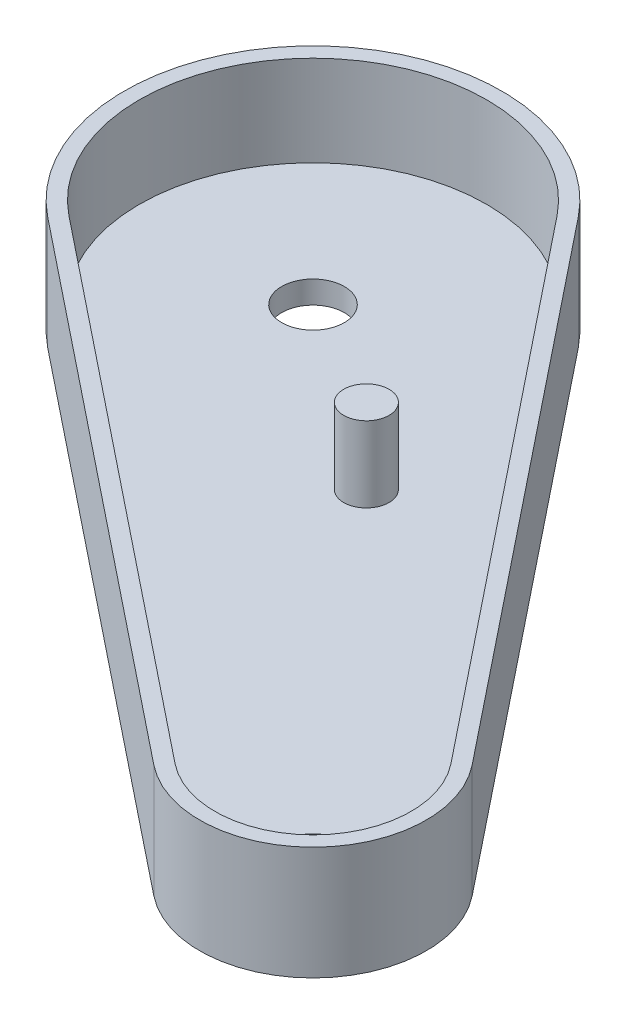
ISO-10303-21;
HEADER;
FILE_DESCRIPTION(('STEP AP214'),'2;1');
FILE_NAME('part.step','',(''),(''),'','','');
FILE_SCHEMA(('AUTOMOTIVE_DESIGN { 1 0 10303 214 1 1 1 1 }'));
ENDSEC;
DATA;
#1=APPLICATION_CONTEXT('core data for automotive mechanical design processes');
#2=APPLICATION_PROTOCOL_DEFINITION('international standard','automotive_design',2000,#1);
#3=PRODUCT_CONTEXT('',#1,'mechanical');
#4=PRODUCT('Part','Part','',(#3));
#5=PRODUCT_RELATED_PRODUCT_CATEGORY('part','',(#4));
#6=PRODUCT_DEFINITION_FORMATION('','',#4);
#7=PRODUCT_DEFINITION_CONTEXT('part definition',#1,'design');
#8=PRODUCT_DEFINITION('design','',#6,#7);
#9=PRODUCT_DEFINITION_SHAPE('','',#8);
#10=(LENGTH_UNIT() NAMED_UNIT(*) SI_UNIT(.MILLI.,.METRE.));
#11=(NAMED_UNIT(*) PLANE_ANGLE_UNIT() SI_UNIT($,.RADIAN.));
#12=(NAMED_UNIT(*) SI_UNIT($,.STERADIAN.) SOLID_ANGLE_UNIT());
#13=UNCERTAINTY_MEASURE_WITH_UNIT(LENGTH_MEASURE(1.E-05),#10,'distance_accuracy_value','');
#14=(GEOMETRIC_REPRESENTATION_CONTEXT(3) GLOBAL_UNCERTAINTY_ASSIGNED_CONTEXT((#13)) GLOBAL_UNIT_ASSIGNED_CONTEXT((#10,
#11,#12)) REPRESENTATION_CONTEXT('',''));
#15=CARTESIAN_POINT('',(0.,0.,0.));
#16=DIRECTION('',(0.,0.,1.));
#17=DIRECTION('',(1.,0.,0.));
#18=AXIS2_PLACEMENT_3D('',#15,#16,#17);
#19=CARTESIAN_POINT('',(-15.6040237198615,3.,19.5323947264538));
#20=DIRECTION('',(0.624160948794458,0.,-0.781295789058153));
#21=DIRECTION('',(-0.781295789058153,0.,-0.624160948794458));
#22=AXIS2_PLACEMENT_3D('',#19,#20,#21);
#23=PLANE('',#22);
#24=DIRECTION('',(0.781295789058153,0.,0.624160948794458));
#25=VECTOR('',#24,1.);
#26=CARTESIAN_POINT('',(-15.6040237198615,0.,19.5323947264538));
#27=LINE('',#26,#25);
#28=CARTESIAN_POINT('',(-15.6040237198615,0.,19.5323947264538));
#29=VERTEX_POINT('',#28);
#30=CARTESIAN_POINT('',(54.2771960748732,0.,75.3590471426608));
#31=VERTEX_POINT('',#30);
#32=EDGE_CURVE('E133',#29,#31,#27,.T.);
#33=ORIENTED_EDGE('',*,*,#32,.T.);
#34=DIRECTION('',(0.,-1.,0.));
#35=VECTOR('',#34,1.);
#36=CARTESIAN_POINT('',(54.2771960748732,3.,75.3590471426608));
#37=LINE('',#36,#35);
#38=CARTESIAN_POINT('',(54.2771960748732,15.,75.3590471426608));
#39=VERTEX_POINT('',#38);
#40=EDGE_CURVE('E11',#39,#31,#37,.T.);
#41=ORIENTED_EDGE('',*,*,#40,.F.);
#42=DIRECTION('',(0.781295789058153,0.,0.624160948794458));
#43=VECTOR('',#42,1.);
#44=CARTESIAN_POINT('',(-15.6040237198615,15.,19.5323947264538));
#45=LINE('',#44,#43);
#46=CARTESIAN_POINT('',(-15.6040237198615,15.,19.5323947264538));
#47=VERTEX_POINT('',#46);
#48=EDGE_CURVE('E146',#47,#39,#45,.T.);
#49=ORIENTED_EDGE('',*,*,#48,.F.);
#50=DIRECTION('',(0.,-1.,0.));
#51=VECTOR('',#50,1.);
#52=CARTESIAN_POINT('',(-15.6040237198615,3.,19.5323947264538));
#53=LINE('',#52,#51);
#54=EDGE_CURVE('E189',#47,#29,#53,.T.);
#55=ORIENTED_EDGE('',*,*,#54,.T.);
#56=EDGE_LOOP('',(#33,#41,#49,#55));
#57=FACE_BOUND('',#56,.T.);
#58=ADVANCED_FACE('F47',(#57),#23,.F.);
#59=CARTESIAN_POINT('',(63.6396103067901,3.,63.6396103067885));
#60=DIRECTION('',(0.,-1.,0.));
#61=DIRECTION('',(0.,0.,-1.));
#62=AXIS2_PLACEMENT_3D('',#59,#60,#61);
#63=CYLINDRICAL_SURFACE('',#62,15.);
#64=CARTESIAN_POINT('',(63.6396103067901,0.,63.6396103067885));
#65=DIRECTION('',(0.,1.,0.));
#66=DIRECTION('',(0.,0.,1.));
#67=AXIS2_PLACEMENT_3D('',#64,#65,#66);
#68=CIRCLE('',#67,15.);
#69=CARTESIAN_POINT('',(75.3590471426621,0.,54.2771960748713));
#70=VERTEX_POINT('',#69);
#71=EDGE_CURVE('E193',#31,#70,#68,.T.);
#72=ORIENTED_EDGE('',*,*,#71,.T.);
#73=DIRECTION('',(0.,-1.,0.));
#74=VECTOR('',#73,1.);
#75=CARTESIAN_POINT('',(75.3590471426621,3.,54.2771960748713));
#76=LINE('',#75,#74);
#77=CARTESIAN_POINT('',(75.3590471426621,15.,54.2771960748713));
#78=VERTEX_POINT('',#77);
#79=EDGE_CURVE('E55',#78,#70,#76,.T.);
#80=ORIENTED_EDGE('',*,*,#79,.F.);
#81=CARTESIAN_POINT('',(63.6396103067901,15.,63.6396103067885));
#82=DIRECTION('',(0.,1.,0.));
#83=DIRECTION('',(0.,0.,1.));
#84=AXIS2_PLACEMENT_3D('',#81,#82,#83);
#85=CIRCLE('',#84,15.);
#86=EDGE_CURVE('E150',#39,#78,#85,.T.);
#87=ORIENTED_EDGE('',*,*,#86,.F.);
#88=ORIENTED_EDGE('',*,*,#40,.T.);
#89=EDGE_LOOP('',(#72,#80,#87,#88));
#90=FACE_BOUND('',#89,.T.);
#91=ADVANCED_FACE('F223',(#90),#63,.T.);
#92=CARTESIAN_POINT('',(19.5323947264534,3.,-15.6040237198619));
#93=DIRECTION('',(0.781295789058138,0.,-0.624160948794477));
#94=DIRECTION('',(-0.624160948794477,0.,-0.781295789058138));
#95=AXIS2_PLACEMENT_3D('',#92,#93,#94);
#96=PLANE('',#95);
#97=DIRECTION('',(0.624160948794477,0.,0.781295789058138));
#98=VECTOR('',#97,1.);
#99=CARTESIAN_POINT('',(19.5323947264534,0.,-15.6040237198619));
#100=LINE('',#99,#98);
#101=CARTESIAN_POINT('',(19.5323947264534,0.,-15.6040237198619));
#102=VERTEX_POINT('',#101);
#103=EDGE_CURVE('E197',#102,#70,#100,.T.);
#104=ORIENTED_EDGE('',*,*,#103,.F.);
#105=DIRECTION('',(0.,-1.,0.));
#106=VECTOR('',#105,1.);
#107=CARTESIAN_POINT('',(19.5323947264534,3.,-15.6040237198619));
#108=LINE('',#107,#106);
#109=CARTESIAN_POINT('',(19.5323947264534,15.,-15.6040237198619));
#110=VERTEX_POINT('',#109);
#111=EDGE_CURVE('E214',#110,#102,#108,.T.);
#112=ORIENTED_EDGE('',*,*,#111,.F.);
#113=DIRECTION('',(-0.624160948794477,0.,-0.781295789058138));
#114=VECTOR('',#113,1.);
#115=CARTESIAN_POINT('',(19.5323947264534,15.,-15.6040237198619));
#116=LINE('',#115,#114);
#117=EDGE_CURVE('E154',#78,#110,#116,.T.);
#118=ORIENTED_EDGE('',*,*,#117,.F.);
#119=ORIENTED_EDGE('',*,*,#79,.T.);
#120=EDGE_LOOP('',(#104,#112,#118,#119));
#121=FACE_BOUND('',#120,.T.);
#122=ADVANCED_FACE('F220',(#121),#96,.T.);
#123=CARTESIAN_POINT('',(63.6396103067901,3.,63.6396103067885));
#124=DIRECTION('',(0.,-1.,0.));
#125=DIRECTION('',(0.,0.,-1.));
#126=AXIS2_PLACEMENT_3D('',#123,#124,#125);
#127=CYLINDRICAL_SURFACE('',#126,4.15);
#128=CARTESIAN_POINT('',(63.6396103067901,3.,63.6396103067885));
#129=DIRECTION('',(0.,1.,0.));
#130=DIRECTION('',(0.,0.,1.));
#131=AXIS2_PLACEMENT_3D('',#128,#129,#130);
#132=CIRCLE('',#131,4.15);
#133=CARTESIAN_POINT('',(63.6396103067901,3.,67.7896103067885));
#134=VERTEX_POINT('',#133);
#135=EDGE_CURVE('E180',#134,#134,#132,.T.);
#136=ORIENTED_EDGE('',*,*,#135,.T.);
#137=EDGE_LOOP('',(#136));
#138=FACE_BOUND('',#137,.T.);
#139=CARTESIAN_POINT('',(63.6396103067901,0.,63.6396103067885));
#140=DIRECTION('',(0.,1.,0.));
#141=DIRECTION('',(0.,0.,1.));
#142=AXIS2_PLACEMENT_3D('',#139,#140,#141);
#143=CIRCLE('',#142,4.15);
#144=CARTESIAN_POINT('',(63.6396103067901,0.,67.7896103067885));
#145=VERTEX_POINT('',#144);
#146=EDGE_CURVE('E204',#145,#145,#143,.T.);
#147=ORIENTED_EDGE('',*,*,#146,.F.);
#148=EDGE_LOOP('',(#147));
#149=FACE_BOUND('',#148,.T.);
#150=ADVANCED_FACE('F257',(#138,#149),#127,.F.);
#151=CARTESIAN_POINT('',(0.,3.,0.));
#152=DIRECTION('',(0.,-1.,0.));
#153=DIRECTION('',(0.,0.,-1.));
#154=AXIS2_PLACEMENT_3D('',#151,#152,#153);
#155=CYLINDRICAL_SURFACE('',#154,25.);
#156=CARTESIAN_POINT('',(0.,0.,0.));
#157=DIRECTION('',(0.,1.,0.));
#158=DIRECTION('',(0.,0.,1.));
#159=AXIS2_PLACEMENT_3D('',#156,#157,#158);
#160=CIRCLE('',#159,25.);
#161=EDGE_CURVE('E201',#102,#29,#160,.T.);
#162=ORIENTED_EDGE('',*,*,#161,.T.);
#163=ORIENTED_EDGE('',*,*,#54,.F.);
#164=CARTESIAN_POINT('',(0.,15.,0.));
#165=DIRECTION('',(0.,1.,0.));
#166=DIRECTION('',(0.,0.,1.));
#167=AXIS2_PLACEMENT_3D('',#164,#165,#166);
#168=CIRCLE('',#167,25.);
#169=EDGE_CURVE('E158',#110,#47,#168,.T.);
#170=ORIENTED_EDGE('',*,*,#169,.F.);
#171=ORIENTED_EDGE('',*,*,#111,.T.);
#172=EDGE_LOOP('',(#162,#163,#170,#171));
#173=FACE_BOUND('',#172,.T.);
#174=ADVANCED_FACE('F230',(#173),#155,.T.);
#175=CARTESIAN_POINT('',(0.,3.,0.));
#176=DIRECTION('',(0.,-1.,0.));
#177=DIRECTION('',(0.,0.,-1.));
#178=AXIS2_PLACEMENT_3D('',#175,#176,#177);
#179=CYLINDRICAL_SURFACE('',#178,4.15);
#180=CARTESIAN_POINT('',(0.,3.,0.));
#181=DIRECTION('',(0.,1.,0.));
#182=DIRECTION('',(0.,0.,1.));
#183=AXIS2_PLACEMENT_3D('',#180,#181,#182);
#184=CIRCLE('',#183,4.15);
#185=CARTESIAN_POINT('',(0.,3.,4.15));
#186=VERTEX_POINT('',#185);
#187=EDGE_CURVE('E184',#186,#186,#184,.T.);
#188=ORIENTED_EDGE('',*,*,#187,.T.);
#189=EDGE_LOOP('',(#188));
#190=FACE_BOUND('',#189,.T.);
#191=CARTESIAN_POINT('',(0.,0.,0.));
#192=DIRECTION('',(0.,1.,0.));
#193=DIRECTION('',(0.,0.,1.));
#194=AXIS2_PLACEMENT_3D('',#191,#192,#193);
#195=CIRCLE('',#194,4.15);
#196=CARTESIAN_POINT('',(0.,0.,4.15));
#197=VERTEX_POINT('',#196);
#198=EDGE_CURVE('E185',#197,#197,#195,.T.);
#199=ORIENTED_EDGE('',*,*,#198,.F.);
#200=EDGE_LOOP('',(#199));
#201=FACE_BOUND('',#200,.T.);
#202=ADVANCED_FACE('F262',(#190,#201),#179,.F.);
#203=CARTESIAN_POINT('',(0.,3.,0.));
#204=DIRECTION('',(0.,1.,0.));
#205=DIRECTION('',(0.,0.,1.));
#206=AXIS2_PLACEMENT_3D('',#203,#204,#205);
#207=PLANE('',#206);
#208=CARTESIAN_POINT('',(24.7487373415294,3.,17.6776695296634));
#209=DIRECTION('',(0.,1.,0.));
#210=DIRECTION('',(0.,0.,1.));
#211=AXIS2_PLACEMENT_3D('',#208,#209,#210);
#212=CIRCLE('',#211,3.);
#213=CARTESIAN_POINT('',(24.7487373415294,3.,20.6776695296634));
#214=VERTEX_POINT('',#213);
#215=EDGE_CURVE('E333',#214,#214,#212,.T.);
#216=ORIENTED_EDGE('',*,*,#215,.F.);
#217=EDGE_LOOP('',(#216));
#218=FACE_BOUND('',#217,.T.);
#219=CARTESIAN_POINT('',(63.6396103067901,3.,63.6396103067885));
#220=DIRECTION('',(0.,1.,0.));
#221=DIRECTION('',(0.,0.,1.));
#222=AXIS2_PLACEMENT_3D('',#219,#220,#221);
#223=CIRCLE('',#222,13.);
#224=CARTESIAN_POINT('',(55.5255179724621,3.,73.7964555645445));
#225=VERTEX_POINT('',#224);
#226=CARTESIAN_POINT('',(73.7964555645458,3.,55.5255179724603));
#227=VERTEX_POINT('',#226);
#228=EDGE_CURVE('E62',#225,#227,#223,.T.);
#229=ORIENTED_EDGE('',*,*,#228,.T.);
#230=DIRECTION('',(0.624160948794477,0.,0.781295789058138));
#231=VECTOR('',#230,1.);
#232=CARTESIAN_POINT('',(17.9698031483372,3.,-14.355701822273));
#233=LINE('',#232,#231);
#234=CARTESIAN_POINT('',(17.9698031483372,3.,-14.355701822273));
#235=VERTEX_POINT('',#234);
#236=EDGE_CURVE('E130',#235,#227,#233,.T.);
#237=ORIENTED_EDGE('',*,*,#236,.F.);
#238=CARTESIAN_POINT('',(0.,3.,0.));
#239=DIRECTION('',(0.,1.,0.));
#240=DIRECTION('',(0.,0.,1.));
#241=AXIS2_PLACEMENT_3D('',#238,#239,#240);
#242=CIRCLE('',#241,23.);
#243=CARTESIAN_POINT('',(-14.3557018222725,3.,17.9698031483375));
#244=VERTEX_POINT('',#243);
#245=EDGE_CURVE('E125',#235,#244,#242,.T.);
#246=ORIENTED_EDGE('',*,*,#245,.T.);
#247=DIRECTION('',(0.781295789058153,0.,0.624160948794458));
#248=VECTOR('',#247,1.);
#249=CARTESIAN_POINT('',(-14.3557018222725,3.,17.9698031483375));
#250=LINE('',#249,#248);
#251=EDGE_CURVE('E67',#244,#225,#250,.T.);
#252=ORIENTED_EDGE('',*,*,#251,.T.);
#253=EDGE_LOOP('',(#229,#237,#246,#252));
#254=FACE_BOUND('',#253,.T.);
#255=ORIENTED_EDGE('',*,*,#135,.F.);
#256=EDGE_LOOP('',(#255));
#257=FACE_BOUND('',#256,.T.);
#258=ORIENTED_EDGE('',*,*,#187,.F.);
#259=EDGE_LOOP('',(#258));
#260=FACE_BOUND('',#259,.T.);
#261=ADVANCED_FACE('F268',(#218,#254,#257,#260),#207,.T.);
#262=CARTESIAN_POINT('',(0.,0.,0.));
#263=DIRECTION('',(0.,1.,0.));
#264=DIRECTION('',(0.,0.,1.));
#265=AXIS2_PLACEMENT_3D('',#262,#263,#264);
#266=PLANE('',#265);
#267=ORIENTED_EDGE('',*,*,#32,.F.);
#268=ORIENTED_EDGE('',*,*,#161,.F.);
#269=ORIENTED_EDGE('',*,*,#103,.T.);
#270=ORIENTED_EDGE('',*,*,#71,.F.);
#271=EDGE_LOOP('',(#267,#268,#269,#270));
#272=FACE_BOUND('',#271,.T.);
#273=ORIENTED_EDGE('',*,*,#146,.T.);
#274=EDGE_LOOP('',(#273));
#275=FACE_BOUND('',#274,.T.);
#276=ORIENTED_EDGE('',*,*,#198,.T.);
#277=EDGE_LOOP('',(#276));
#278=FACE_BOUND('',#277,.T.);
#279=ADVANCED_FACE('F227',(#272,#275,#278),#266,.F.);
#280=CARTESIAN_POINT('',(17.9698031483372,15.,-14.355701822273));
#281=DIRECTION('',(0.781295789058137,0.,-0.624160948794477));
#282=DIRECTION('',(-0.624160948794477,0.,-0.781295789058137));
#283=AXIS2_PLACEMENT_3D('',#280,#281,#282);
#284=PLANE('',#283);
#285=ORIENTED_EDGE('',*,*,#236,.T.);
#286=DIRECTION('',(0.,-1.,0.));
#287=VECTOR('',#286,1.);
#288=CARTESIAN_POINT('',(73.7964555645459,15.,55.5255179724603));
#289=LINE('',#288,#287);
#290=CARTESIAN_POINT('',(73.7964555645459,15.,55.5255179724603));
#291=VERTEX_POINT('',#290);
#292=EDGE_CURVE('E128',#291,#227,#289,.T.);
#293=ORIENTED_EDGE('',*,*,#292,.F.);
#294=DIRECTION('',(0.624160948794477,0.,0.781295789058138));
#295=VECTOR('',#294,1.);
#296=CARTESIAN_POINT('',(17.9698031483372,15.,-14.355701822273));
#297=LINE('',#296,#295);
#298=CARTESIAN_POINT('',(17.9698031483372,15.,-14.355701822273));
#299=VERTEX_POINT('',#298);
#300=EDGE_CURVE('E112',#299,#291,#297,.T.);
#301=ORIENTED_EDGE('',*,*,#300,.F.);
#302=DIRECTION('',(0.,-1.,0.));
#303=VECTOR('',#302,1.);
#304=CARTESIAN_POINT('',(17.9698031483372,15.,-14.355701822273));
#305=LINE('',#304,#303);
#306=EDGE_CURVE('E162',#299,#235,#305,.T.);
#307=ORIENTED_EDGE('',*,*,#306,.T.);
#308=EDGE_LOOP('',(#285,#293,#301,#307));
#309=FACE_BOUND('',#308,.T.);
#310=ADVANCED_FACE('F129',(#309),#284,.F.);
#311=CARTESIAN_POINT('',(63.6396103067901,15.,63.6396103067885));
#312=DIRECTION('',(0.,-1.,0.));
#313=DIRECTION('',(0.,0.,-1.));
#314=AXIS2_PLACEMENT_3D('',#311,#312,#313);
#315=CYLINDRICAL_SURFACE('',#314,13.);
#316=ORIENTED_EDGE('',*,*,#228,.F.);
#317=DIRECTION('',(0.,-1.,0.));
#318=VECTOR('',#317,1.);
#319=CARTESIAN_POINT('',(55.5255179724621,15.,73.7964555645445));
#320=LINE('',#319,#318);
#321=CARTESIAN_POINT('',(55.5255179724621,15.,73.7964555645445));
#322=VERTEX_POINT('',#321);
#323=EDGE_CURVE('E134',#322,#225,#320,.T.);
#324=ORIENTED_EDGE('',*,*,#323,.F.);
#325=CARTESIAN_POINT('',(63.6396103067901,15.,63.6396103067885));
#326=DIRECTION('',(0.,1.,0.));
#327=DIRECTION('',(0.,0.,1.));
#328=AXIS2_PLACEMENT_3D('',#325,#326,#327);
#329=CIRCLE('',#328,13.);
#330=EDGE_CURVE('E118',#322,#291,#329,.T.);
#331=ORIENTED_EDGE('',*,*,#330,.T.);
#332=ORIENTED_EDGE('',*,*,#292,.T.);
#333=EDGE_LOOP('',(#316,#324,#331,#332));
#334=FACE_BOUND('',#333,.T.);
#335=ADVANCED_FACE('F136',(#334),#315,.F.);
#336=CARTESIAN_POINT('',(-14.3557018222725,15.,17.9698031483375));
#337=DIRECTION('',(0.624160948794458,0.,-0.781295789058153));
#338=DIRECTION('',(-0.781295789058153,0.,-0.624160948794458));
#339=AXIS2_PLACEMENT_3D('',#336,#337,#338);
#340=PLANE('',#339);
#341=ORIENTED_EDGE('',*,*,#251,.F.);
#342=DIRECTION('',(0.,-1.,0.));
#343=VECTOR('',#342,1.);
#344=CARTESIAN_POINT('',(-14.3557018222725,15.,17.9698031483375));
#345=LINE('',#344,#343);
#346=CARTESIAN_POINT('',(-14.3557018222725,15.,17.9698031483375));
#347=VERTEX_POINT('',#346);
#348=EDGE_CURVE('E174',#347,#244,#345,.T.);
#349=ORIENTED_EDGE('',*,*,#348,.F.);
#350=DIRECTION('',(0.781295789058153,0.,0.624160948794458));
#351=VECTOR('',#350,1.);
#352=CARTESIAN_POINT('',(-14.3557018222725,15.,17.9698031483375));
#353=LINE('',#352,#351);
#354=EDGE_CURVE('E138',#347,#322,#353,.T.);
#355=ORIENTED_EDGE('',*,*,#354,.T.);
#356=ORIENTED_EDGE('',*,*,#323,.T.);
#357=EDGE_LOOP('',(#341,#349,#355,#356));
#358=FACE_BOUND('',#357,.T.);
#359=ADVANCED_FACE('F246',(#358),#340,.T.);
#360=CARTESIAN_POINT('',(0.,15.,0.));
#361=DIRECTION('',(0.,-1.,0.));
#362=DIRECTION('',(0.,0.,-1.));
#363=AXIS2_PLACEMENT_3D('',#360,#361,#362);
#364=CYLINDRICAL_SURFACE('',#363,23.);
#365=ORIENTED_EDGE('',*,*,#245,.F.);
#366=ORIENTED_EDGE('',*,*,#306,.F.);
#367=CARTESIAN_POINT('',(0.,15.,0.));
#368=DIRECTION('',(0.,1.,0.));
#369=DIRECTION('',(0.,0.,1.));
#370=AXIS2_PLACEMENT_3D('',#367,#368,#369);
#371=CIRCLE('',#370,23.);
#372=EDGE_CURVE('E121',#299,#347,#371,.T.);
#373=ORIENTED_EDGE('',*,*,#372,.T.);
#374=ORIENTED_EDGE('',*,*,#348,.T.);
#375=EDGE_LOOP('',(#365,#366,#373,#374));
#376=FACE_BOUND('',#375,.T.);
#377=ADVANCED_FACE('F236',(#376),#364,.F.);
#378=CARTESIAN_POINT('',(0.,15.,0.));
#379=DIRECTION('',(0.,1.,0.));
#380=DIRECTION('',(0.,0.,1.));
#381=AXIS2_PLACEMENT_3D('',#378,#379,#380);
#382=PLANE('',#381);
#383=ORIENTED_EDGE('',*,*,#300,.T.);
#384=ORIENTED_EDGE('',*,*,#330,.F.);
#385=ORIENTED_EDGE('',*,*,#354,.F.);
#386=ORIENTED_EDGE('',*,*,#372,.F.);
#387=EDGE_LOOP('',(#383,#384,#385,#386));
#388=FACE_BOUND('',#387,.T.);
#389=ORIENTED_EDGE('',*,*,#48,.T.);
#390=ORIENTED_EDGE('',*,*,#86,.T.);
#391=ORIENTED_EDGE('',*,*,#117,.T.);
#392=ORIENTED_EDGE('',*,*,#169,.T.);
#393=EDGE_LOOP('',(#389,#390,#391,#392));
#394=FACE_BOUND('',#393,.T.);
#395=ADVANCED_FACE('F114',(#388,#394),#382,.T.);
#396=CARTESIAN_POINT('',(24.7487373415294,13.,17.6776695296634));
#397=DIRECTION('',(0.,-1.,0.));
#398=DIRECTION('',(0.,0.,-1.));
#399=AXIS2_PLACEMENT_3D('',#396,#397,#398);
#400=CYLINDRICAL_SURFACE('',#399,3.);
#401=CARTESIAN_POINT('',(24.7487373415294,13.,17.6776695296634));
#402=DIRECTION('',(0.,1.,0.));
#403=DIRECTION('',(0.,0.,1.));
#404=AXIS2_PLACEMENT_3D('',#401,#402,#403);
#405=CIRCLE('',#404,3.);
#406=CARTESIAN_POINT('',(24.7487373415294,13.,20.6776695296634));
#407=VERTEX_POINT('',#406);
#408=EDGE_CURVE('E165',#407,#407,#405,.T.);
#409=ORIENTED_EDGE('',*,*,#408,.F.);
#410=EDGE_LOOP('',(#409));
#411=FACE_BOUND('',#410,.T.);
#412=ORIENTED_EDGE('',*,*,#215,.T.);
#413=EDGE_LOOP('',(#412));
#414=FACE_BOUND('',#413,.T.);
#415=ADVANCED_FACE('F235',(#411,#414),#400,.T.);
#416=CARTESIAN_POINT('',(0.,13.,0.));
#417=DIRECTION('',(0.,1.,0.));
#418=DIRECTION('',(0.,0.,1.));
#419=AXIS2_PLACEMENT_3D('',#416,#417,#418);
#420=PLANE('',#419);
#421=ORIENTED_EDGE('',*,*,#408,.T.);
#422=EDGE_LOOP('',(#421));
#423=FACE_BOUND('',#422,.T.);
#424=ADVANCED_FACE('F243',(#423),#420,.T.);
#425=CLOSED_SHELL('',(#58,#91,#122,#150,#174,#202,#261,#279,#310,#335,#359,#377,#395,#415,#424));
#426=MANIFOLD_SOLID_BREP('B2',#425);
#427=ADVANCED_BREP_SHAPE_REPRESENTATION('',(#18,#426),#14);
#428=SHAPE_DEFINITION_REPRESENTATION(#9,#427);
ENDSEC;
END-ISO-10303-21;
